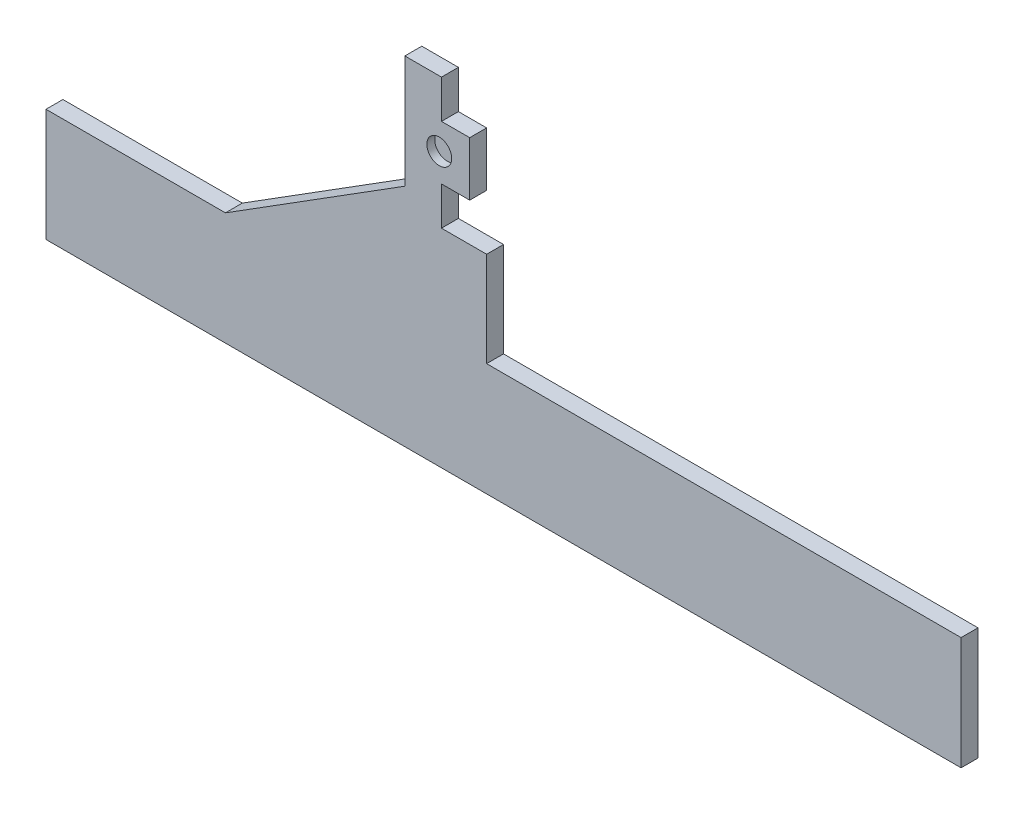
ISO-10303-21;
HEADER;
FILE_DESCRIPTION(('STEP AP214'),'2;1');
FILE_NAME('part.step','',(''),(''),'','','');
FILE_SCHEMA(('AUTOMOTIVE_DESIGN { 1 0 10303 214 1 1 1 1 }'));
ENDSEC;
DATA;
#1=APPLICATION_CONTEXT('core data for automotive mechanical design processes');
#2=APPLICATION_PROTOCOL_DEFINITION('international standard','automotive_design',2000,#1);
#3=PRODUCT_CONTEXT('',#1,'mechanical');
#4=PRODUCT('Part','Part','',(#3));
#5=PRODUCT_RELATED_PRODUCT_CATEGORY('part','',(#4));
#6=PRODUCT_DEFINITION_FORMATION('','',#4);
#7=PRODUCT_DEFINITION_CONTEXT('part definition',#1,'design');
#8=PRODUCT_DEFINITION('design','',#6,#7);
#9=PRODUCT_DEFINITION_SHAPE('','',#8);
#10=(LENGTH_UNIT() NAMED_UNIT(*) SI_UNIT(.MILLI.,.METRE.));
#11=(NAMED_UNIT(*) PLANE_ANGLE_UNIT() SI_UNIT($,.RADIAN.));
#12=(NAMED_UNIT(*) SI_UNIT($,.STERADIAN.) SOLID_ANGLE_UNIT());
#13=UNCERTAINTY_MEASURE_WITH_UNIT(LENGTH_MEASURE(1.E-05),#10,'distance_accuracy_value','');
#14=(GEOMETRIC_REPRESENTATION_CONTEXT(3) GLOBAL_UNCERTAINTY_ASSIGNED_CONTEXT((#13)) GLOBAL_UNIT_ASSIGNED_CONTEXT((#10,
#11,#12)) REPRESENTATION_CONTEXT('',''));
#15=CARTESIAN_POINT('',(0.,0.,0.));
#16=DIRECTION('',(0.,0.,1.));
#17=DIRECTION('',(1.,0.,0.));
#18=AXIS2_PLACEMENT_3D('',#15,#16,#17);
#19=CARTESIAN_POINT('',(-15.,50.,15.));
#20=DIRECTION('',(0.,-1.,0.));
#21=DIRECTION('',(0.,0.,-1.));
#22=AXIS2_PLACEMENT_3D('',#19,#20,#21);
#23=PLANE('',#22);
#24=DIRECTION('',(-1.,0.,0.));
#25=VECTOR('',#24,1.);
#26=CARTESIAN_POINT('',(-15.,50.,0.));
#27=LINE('',#26,#25);
#28=CARTESIAN_POINT('',(405.6,50.,0.));
#29=VERTEX_POINT('',#28);
#30=CARTESIAN_POINT('',(-15.,50.,0.));
#31=VERTEX_POINT('',#30);
#32=EDGE_CURVE('E171',#29,#31,#27,.T.);
#33=ORIENTED_EDGE('',*,*,#32,.T.);
#34=DIRECTION('',(0.,0.,-1.));
#35=VECTOR('',#34,1.);
#36=CARTESIAN_POINT('',(-15.,50.,15.));
#37=LINE('',#36,#35);
#38=CARTESIAN_POINT('',(-15.,50.,15.));
#39=VERTEX_POINT('',#38);
#40=EDGE_CURVE('E11',#39,#31,#37,.T.);
#41=ORIENTED_EDGE('',*,*,#40,.F.);
#42=DIRECTION('',(-1.,0.,0.));
#43=VECTOR('',#42,1.);
#44=CARTESIAN_POINT('',(-15.,50.,15.));
#45=LINE('',#44,#43);
#46=CARTESIAN_POINT('',(405.6,50.,15.));
#47=VERTEX_POINT('',#46);
#48=EDGE_CURVE('E200',#47,#39,#45,.T.);
#49=ORIENTED_EDGE('',*,*,#48,.F.);
#50=DIRECTION('',(0.,0.,-1.));
#51=VECTOR('',#50,1.);
#52=CARTESIAN_POINT('',(405.6,50.,15.));
#53=LINE('',#52,#51);
#54=EDGE_CURVE('E167',#47,#29,#53,.T.);
#55=ORIENTED_EDGE('',*,*,#54,.T.);
#56=EDGE_LOOP('',(#33,#41,#49,#55));
#57=FACE_BOUND('',#56,.T.);
#58=ADVANCED_FACE('F33',(#57),#23,.F.);
#59=CARTESIAN_POINT('',(-15.,50.,15.));
#60=DIRECTION('',(-1.,0.,0.));
#61=DIRECTION('',(0.,0.,1.));
#62=AXIS2_PLACEMENT_3D('',#59,#60,#61);
#63=PLANE('',#62);
#64=DIRECTION('',(0.,1.,0.));
#65=VECTOR('',#64,1.);
#66=CARTESIAN_POINT('',(-15.,50.,0.));
#67=LINE('',#66,#65);
#68=CARTESIAN_POINT('',(-15.,134.,0.));
#69=VERTEX_POINT('',#68);
#70=EDGE_CURVE('E174',#31,#69,#67,.T.);
#71=ORIENTED_EDGE('',*,*,#70,.T.);
#72=DIRECTION('',(0.,0.,-1.));
#73=VECTOR('',#72,1.);
#74=CARTESIAN_POINT('',(-15.,134.,15.));
#75=LINE('',#74,#73);
#76=CARTESIAN_POINT('',(-15.,134.,15.));
#77=VERTEX_POINT('',#76);
#78=EDGE_CURVE('E41',#77,#69,#75,.T.);
#79=ORIENTED_EDGE('',*,*,#78,.F.);
#80=DIRECTION('',(0.,1.,0.));
#81=VECTOR('',#80,1.);
#82=CARTESIAN_POINT('',(-15.,50.,15.));
#83=LINE('',#82,#81);
#84=EDGE_CURVE('E113',#39,#77,#83,.T.);
#85=ORIENTED_EDGE('',*,*,#84,.F.);
#86=ORIENTED_EDGE('',*,*,#40,.T.);
#87=EDGE_LOOP('',(#71,#79,#85,#86));
#88=FACE_BOUND('',#87,.T.);
#89=ADVANCED_FACE('F294',(#88),#63,.F.);
#90=CARTESIAN_POINT('',(-15.,134.,15.));
#91=DIRECTION('',(0.,-1.,0.));
#92=DIRECTION('',(1.,0.,0.));
#93=AXIS2_PLACEMENT_3D('',#90,#91,#92);
#94=PLANE('',#93);
#95=DIRECTION('',(-1.,0.,0.));
#96=VECTOR('',#95,1.);
#97=CARTESIAN_POINT('',(-15.,134.,0.));
#98=LINE('',#97,#96);
#99=CARTESIAN_POINT('',(-55.,134.,0.));
#100=VERTEX_POINT('',#99);
#101=EDGE_CURVE('E177',#69,#100,#98,.T.);
#102=ORIENTED_EDGE('',*,*,#101,.T.);
#103=DIRECTION('',(0.,0.,-1.));
#104=VECTOR('',#103,1.);
#105=CARTESIAN_POINT('',(-55.,134.,15.));
#106=LINE('',#105,#104);
#107=CARTESIAN_POINT('',(-55.,134.,15.));
#108=VERTEX_POINT('',#107);
#109=EDGE_CURVE('E228',#108,#100,#106,.T.);
#110=ORIENTED_EDGE('',*,*,#109,.F.);
#111=DIRECTION('',(-1.,0.,0.));
#112=VECTOR('',#111,1.);
#113=CARTESIAN_POINT('',(-15.,134.,15.));
#114=LINE('',#113,#112);
#115=EDGE_CURVE('E236',#77,#108,#114,.T.);
#116=ORIENTED_EDGE('',*,*,#115,.F.);
#117=ORIENTED_EDGE('',*,*,#78,.T.);
#118=EDGE_LOOP('',(#102,#110,#116,#117));
#119=FACE_BOUND('',#118,.T.);
#120=ADVANCED_FACE('F234',(#119),#94,.F.);
#121=CARTESIAN_POINT('',(-55.,134.,15.));
#122=DIRECTION('',(-1.,0.,0.));
#123=DIRECTION('',(0.,0.,1.));
#124=AXIS2_PLACEMENT_3D('',#121,#122,#123);
#125=PLANE('',#124);
#126=DIRECTION('',(0.,1.,0.));
#127=VECTOR('',#126,1.);
#128=CARTESIAN_POINT('',(-55.,134.,0.));
#129=LINE('',#128,#127);
#130=CARTESIAN_POINT('',(-55.,168.,0.));
#131=VERTEX_POINT('',#130);
#132=EDGE_CURVE('E179',#100,#131,#129,.T.);
#133=ORIENTED_EDGE('',*,*,#132,.T.);
#134=DIRECTION('',(0.,0.,-1.));
#135=VECTOR('',#134,1.);
#136=CARTESIAN_POINT('',(-55.,168.,15.));
#137=LINE('',#136,#135);
#138=CARTESIAN_POINT('',(-55.,168.,15.));
#139=VERTEX_POINT('',#138);
#140=EDGE_CURVE('E225',#139,#131,#137,.T.);
#141=ORIENTED_EDGE('',*,*,#140,.F.);
#142=DIRECTION('',(0.,1.,0.));
#143=VECTOR('',#142,1.);
#144=CARTESIAN_POINT('',(-55.,134.,15.));
#145=LINE('',#144,#143);
#146=EDGE_CURVE('E254',#108,#139,#145,.T.);
#147=ORIENTED_EDGE('',*,*,#146,.F.);
#148=ORIENTED_EDGE('',*,*,#109,.T.);
#149=EDGE_LOOP('',(#133,#141,#147,#148));
#150=FACE_BOUND('',#149,.T.);
#151=ADVANCED_FACE('F245',(#150),#125,.F.);
#152=CARTESIAN_POINT('',(-30.,168.,15.));
#153=DIRECTION('',(0.,1.,0.));
#154=DIRECTION('',(0.,0.,1.));
#155=AXIS2_PLACEMENT_3D('',#152,#153,#154);
#156=PLANE('',#155);
#157=DIRECTION('',(1.,0.,0.));
#158=VECTOR('',#157,1.);
#159=CARTESIAN_POINT('',(-30.,168.,0.));
#160=LINE('',#159,#158);
#161=CARTESIAN_POINT('',(-30.,168.,0.));
#162=VERTEX_POINT('',#161);
#163=EDGE_CURVE('E181',#131,#162,#160,.T.);
#164=ORIENTED_EDGE('',*,*,#163,.T.);
#165=DIRECTION('',(0.,0.,-1.));
#166=VECTOR('',#165,1.);
#167=CARTESIAN_POINT('',(-30.,168.,15.));
#168=LINE('',#167,#166);
#169=CARTESIAN_POINT('',(-30.,168.,15.));
#170=VERTEX_POINT('',#169);
#171=EDGE_CURVE('E222',#170,#162,#168,.T.);
#172=ORIENTED_EDGE('',*,*,#171,.F.);
#173=DIRECTION('',(1.,0.,0.));
#174=VECTOR('',#173,1.);
#175=CARTESIAN_POINT('',(-30.,168.,15.));
#176=LINE('',#175,#174);
#177=EDGE_CURVE('E251',#139,#170,#176,.T.);
#178=ORIENTED_EDGE('',*,*,#177,.F.);
#179=ORIENTED_EDGE('',*,*,#140,.T.);
#180=EDGE_LOOP('',(#164,#172,#178,#179));
#181=FACE_BOUND('',#180,.T.);
#182=ADVANCED_FACE('F249',(#181),#156,.F.);
#183=CARTESIAN_POINT('',(-30.,168.,15.));
#184=DIRECTION('',(-1.,0.,0.));
#185=DIRECTION('',(0.,0.,1.));
#186=AXIS2_PLACEMENT_3D('',#183,#184,#185);
#187=PLANE('',#186);
#188=DIRECTION('',(0.,1.,0.));
#189=VECTOR('',#188,1.);
#190=CARTESIAN_POINT('',(-30.,168.,0.));
#191=LINE('',#190,#189);
#192=CARTESIAN_POINT('',(-30.,216.,0.));
#193=VERTEX_POINT('',#192);
#194=EDGE_CURVE('E183',#162,#193,#191,.T.);
#195=ORIENTED_EDGE('',*,*,#194,.T.);
#196=DIRECTION('',(0.,0.,-1.));
#197=VECTOR('',#196,1.);
#198=CARTESIAN_POINT('',(-30.,216.,15.));
#199=LINE('',#198,#197);
#200=CARTESIAN_POINT('',(-30.,216.,15.));
#201=VERTEX_POINT('',#200);
#202=EDGE_CURVE('E219',#201,#193,#199,.T.);
#203=ORIENTED_EDGE('',*,*,#202,.F.);
#204=DIRECTION('',(0.,1.,0.));
#205=VECTOR('',#204,1.);
#206=CARTESIAN_POINT('',(-30.,168.,15.));
#207=LINE('',#206,#205);
#208=EDGE_CURVE('E253',#170,#201,#207,.T.);
#209=ORIENTED_EDGE('',*,*,#208,.F.);
#210=ORIENTED_EDGE('',*,*,#171,.T.);
#211=EDGE_LOOP('',(#195,#203,#209,#210));
#212=FACE_BOUND('',#211,.T.);
#213=ADVANCED_FACE('F307',(#212),#187,.F.);
#214=CARTESIAN_POINT('',(-30.,216.,15.));
#215=DIRECTION('',(0.,-1.,0.));
#216=DIRECTION('',(0.,0.,-1.));
#217=AXIS2_PLACEMENT_3D('',#214,#215,#216);
#218=PLANE('',#217);
#219=DIRECTION('',(-1.,0.,0.));
#220=VECTOR('',#219,1.);
#221=CARTESIAN_POINT('',(-30.,216.,0.));
#222=LINE('',#221,#220);
#223=CARTESIAN_POINT('',(-55.,216.,0.));
#224=VERTEX_POINT('',#223);
#225=EDGE_CURVE('E185',#193,#224,#222,.T.);
#226=ORIENTED_EDGE('',*,*,#225,.T.);
#227=DIRECTION('',(0.,0.,-1.));
#228=VECTOR('',#227,1.);
#229=CARTESIAN_POINT('',(-55.,216.,15.));
#230=LINE('',#229,#228);
#231=CARTESIAN_POINT('',(-55.,216.,15.));
#232=VERTEX_POINT('',#231);
#233=EDGE_CURVE('E216',#232,#224,#230,.T.);
#234=ORIENTED_EDGE('',*,*,#233,.F.);
#235=DIRECTION('',(-1.,0.,0.));
#236=VECTOR('',#235,1.);
#237=CARTESIAN_POINT('',(-30.,216.,15.));
#238=LINE('',#237,#236);
#239=EDGE_CURVE('E256',#201,#232,#238,.T.);
#240=ORIENTED_EDGE('',*,*,#239,.F.);
#241=ORIENTED_EDGE('',*,*,#202,.T.);
#242=EDGE_LOOP('',(#226,#234,#240,#241));
#243=FACE_BOUND('',#242,.T.);
#244=ADVANCED_FACE('F310',(#243),#218,.F.);
#245=CARTESIAN_POINT('',(-55.,250.,15.));
#246=DIRECTION('',(-1.,0.,0.));
#247=DIRECTION('',(0.,-1.,0.));
#248=AXIS2_PLACEMENT_3D('',#245,#246,#247);
#249=PLANE('',#248);
#250=DIRECTION('',(0.,1.,0.));
#251=VECTOR('',#250,1.);
#252=CARTESIAN_POINT('',(-55.,250.,0.));
#253=LINE('',#252,#251);
#254=CARTESIAN_POINT('',(-55.,250.,0.));
#255=VERTEX_POINT('',#254);
#256=EDGE_CURVE('E187',#224,#255,#253,.T.);
#257=ORIENTED_EDGE('',*,*,#256,.T.);
#258=DIRECTION('',(0.,0.,-1.));
#259=VECTOR('',#258,1.);
#260=CARTESIAN_POINT('',(-55.,250.,15.));
#261=LINE('',#260,#259);
#262=CARTESIAN_POINT('',(-55.,250.,15.));
#263=VERTEX_POINT('',#262);
#264=EDGE_CURVE('E213',#263,#255,#261,.T.);
#265=ORIENTED_EDGE('',*,*,#264,.F.);
#266=DIRECTION('',(0.,1.,0.));
#267=VECTOR('',#266,1.);
#268=CARTESIAN_POINT('',(-55.,250.,15.));
#269=LINE('',#268,#267);
#270=EDGE_CURVE('E262',#232,#263,#269,.T.);
#271=ORIENTED_EDGE('',*,*,#270,.F.);
#272=ORIENTED_EDGE('',*,*,#233,.T.);
#273=EDGE_LOOP('',(#257,#265,#271,#272));
#274=FACE_BOUND('',#273,.T.);
#275=ADVANCED_FACE('F314',(#274),#249,.F.);
#276=CARTESIAN_POINT('',(-55.,250.,15.));
#277=DIRECTION('',(0.,-1.,0.));
#278=DIRECTION('',(0.,0.,-1.));
#279=AXIS2_PLACEMENT_3D('',#276,#277,#278);
#280=PLANE('',#279);
#281=DIRECTION('',(-1.,0.,0.));
#282=VECTOR('',#281,1.);
#283=CARTESIAN_POINT('',(-55.,250.,0.));
#284=LINE('',#283,#282);
#285=CARTESIAN_POINT('',(-87.48,250.,0.));
#286=VERTEX_POINT('',#285);
#287=EDGE_CURVE('E189',#255,#286,#284,.T.);
#288=ORIENTED_EDGE('',*,*,#287,.T.);
#289=DIRECTION('',(0.,0.,-1.));
#290=VECTOR('',#289,1.);
#291=CARTESIAN_POINT('',(-87.48,250.,15.));
#292=LINE('',#291,#290);
#293=CARTESIAN_POINT('',(-87.48,250.,15.));
#294=VERTEX_POINT('',#293);
#295=EDGE_CURVE('E210',#294,#286,#292,.T.);
#296=ORIENTED_EDGE('',*,*,#295,.F.);
#297=DIRECTION('',(-1.,0.,0.));
#298=VECTOR('',#297,1.);
#299=CARTESIAN_POINT('',(-55.,250.,15.));
#300=LINE('',#299,#298);
#301=EDGE_CURVE('E264',#263,#294,#300,.T.);
#302=ORIENTED_EDGE('',*,*,#301,.F.);
#303=ORIENTED_EDGE('',*,*,#264,.T.);
#304=EDGE_LOOP('',(#288,#296,#302,#303));
#305=FACE_BOUND('',#304,.T.);
#306=ADVANCED_FACE('F318',(#305),#280,.F.);
#307=CARTESIAN_POINT('',(-87.48,250.,15.));
#308=DIRECTION('',(1.,0.,0.));
#309=DIRECTION('',(0.,1.,0.));
#310=AXIS2_PLACEMENT_3D('',#307,#308,#309);
#311=PLANE('',#310);
#312=DIRECTION('',(0.,-1.,0.));
#313=VECTOR('',#312,1.);
#314=CARTESIAN_POINT('',(-87.48,250.,0.));
#315=LINE('',#314,#313);
#316=CARTESIAN_POINT('',(-87.48,150.,0.));
#317=VERTEX_POINT('',#316);
#318=EDGE_CURVE('E191',#286,#317,#315,.T.);
#319=ORIENTED_EDGE('',*,*,#318,.T.);
#320=DIRECTION('',(0.,0.,-1.));
#321=VECTOR('',#320,1.);
#322=CARTESIAN_POINT('',(-87.48,150.,15.));
#323=LINE('',#322,#321);
#324=CARTESIAN_POINT('',(-87.48,150.,15.));
#325=VERTEX_POINT('',#324);
#326=EDGE_CURVE('E207',#325,#317,#323,.T.);
#327=ORIENTED_EDGE('',*,*,#326,.F.);
#328=DIRECTION('',(0.,-1.,0.));
#329=VECTOR('',#328,1.);
#330=CARTESIAN_POINT('',(-87.48,250.,15.));
#331=LINE('',#330,#329);
#332=EDGE_CURVE('E266',#294,#325,#331,.T.);
#333=ORIENTED_EDGE('',*,*,#332,.F.);
#334=ORIENTED_EDGE('',*,*,#295,.T.);
#335=EDGE_LOOP('',(#319,#327,#333,#334));
#336=FACE_BOUND('',#335,.T.);
#337=ADVANCED_FACE('F322',(#336),#311,.F.);
#338=CARTESIAN_POINT('',(-87.48,150.,15.));
#339=DIRECTION('',(0.532245665161482,-0.846589955005853,0.));
#340=DIRECTION('',(0.846589955005853,0.532245665161482,0.));
#341=AXIS2_PLACEMENT_3D('',#338,#339,#340);
#342=PLANE('',#341);
#343=DIRECTION('',(-0.846589955005853,-0.532245665161482,0.));
#344=VECTOR('',#343,1.);
#345=CARTESIAN_POINT('',(-87.48,150.,0.));
#346=LINE('',#345,#344);
#347=CARTESIAN_POINT('',(-246.54,50.,0.));
#348=VERTEX_POINT('',#347);
#349=EDGE_CURVE('E193',#317,#348,#346,.T.);
#350=ORIENTED_EDGE('',*,*,#349,.T.);
#351=DIRECTION('',(0.,0.,-1.));
#352=VECTOR('',#351,1.);
#353=CARTESIAN_POINT('',(-246.54,50.,15.));
#354=LINE('',#353,#352);
#355=CARTESIAN_POINT('',(-246.54,50.,15.));
#356=VERTEX_POINT('',#355);
#357=EDGE_CURVE('E204',#356,#348,#354,.T.);
#358=ORIENTED_EDGE('',*,*,#357,.F.);
#359=DIRECTION('',(-0.846589955005853,-0.532245665161482,0.));
#360=VECTOR('',#359,1.);
#361=CARTESIAN_POINT('',(-87.48,150.,15.));
#362=LINE('',#361,#360);
#363=EDGE_CURVE('E268',#325,#356,#362,.T.);
#364=ORIENTED_EDGE('',*,*,#363,.F.);
#365=ORIENTED_EDGE('',*,*,#326,.T.);
#366=EDGE_LOOP('',(#350,#358,#364,#365));
#367=FACE_BOUND('',#366,.T.);
#368=ADVANCED_FACE('F274',(#367),#342,.F.);
#369=CARTESIAN_POINT('',(-405.6,50.,15.));
#370=DIRECTION('',(0.,-1.,0.));
#371=DIRECTION('',(0.,0.,-1.));
#372=AXIS2_PLACEMENT_3D('',#369,#370,#371);
#373=PLANE('',#372);
#374=DIRECTION('',(-1.,0.,0.));
#375=VECTOR('',#374,1.);
#376=CARTESIAN_POINT('',(-405.6,50.,0.));
#377=LINE('',#376,#375);
#378=CARTESIAN_POINT('',(-405.6,50.,0.));
#379=VERTEX_POINT('',#378);
#380=EDGE_CURVE('E195',#348,#379,#377,.T.);
#381=ORIENTED_EDGE('',*,*,#380,.T.);
#382=DIRECTION('',(0.,0.,-1.));
#383=VECTOR('',#382,1.);
#384=CARTESIAN_POINT('',(-405.6,50.,15.));
#385=LINE('',#384,#383);
#386=CARTESIAN_POINT('',(-405.6,50.,15.));
#387=VERTEX_POINT('',#386);
#388=EDGE_CURVE('E162',#387,#379,#385,.T.);
#389=ORIENTED_EDGE('',*,*,#388,.F.);
#390=DIRECTION('',(-1.,0.,0.));
#391=VECTOR('',#390,1.);
#392=CARTESIAN_POINT('',(-405.6,50.,15.));
#393=LINE('',#392,#391);
#394=EDGE_CURVE('E153',#356,#387,#393,.T.);
#395=ORIENTED_EDGE('',*,*,#394,.F.);
#396=ORIENTED_EDGE('',*,*,#357,.T.);
#397=EDGE_LOOP('',(#381,#389,#395,#396));
#398=FACE_BOUND('',#397,.T.);
#399=ADVANCED_FACE('F278',(#398),#373,.F.);
#400=CARTESIAN_POINT('',(-405.6,-50.,15.));
#401=DIRECTION('',(1.,0.,0.));
#402=DIRECTION('',(0.,0.,-1.));
#403=AXIS2_PLACEMENT_3D('',#400,#401,#402);
#404=PLANE('',#403);
#405=DIRECTION('',(0.,-1.,0.));
#406=VECTOR('',#405,1.);
#407=CARTESIAN_POINT('',(-405.6,-50.,0.));
#408=LINE('',#407,#406);
#409=CARTESIAN_POINT('',(-405.6,-50.,0.));
#410=VERTEX_POINT('',#409);
#411=EDGE_CURVE('E161',#379,#410,#408,.T.);
#412=ORIENTED_EDGE('',*,*,#411,.T.);
#413=DIRECTION('',(0.,0.,-1.));
#414=VECTOR('',#413,1.);
#415=CARTESIAN_POINT('',(-405.6,-50.,15.));
#416=LINE('',#415,#414);
#417=CARTESIAN_POINT('',(-405.6,-50.,15.));
#418=VERTEX_POINT('',#417);
#419=EDGE_CURVE('E158',#418,#410,#416,.T.);
#420=ORIENTED_EDGE('',*,*,#419,.F.);
#421=DIRECTION('',(0.,-1.,0.));
#422=VECTOR('',#421,1.);
#423=CARTESIAN_POINT('',(-405.6,-50.,15.));
#424=LINE('',#423,#422);
#425=EDGE_CURVE('E147',#387,#418,#424,.T.);
#426=ORIENTED_EDGE('',*,*,#425,.F.);
#427=ORIENTED_EDGE('',*,*,#388,.T.);
#428=EDGE_LOOP('',(#412,#420,#426,#427));
#429=FACE_BOUND('',#428,.T.);
#430=ADVANCED_FACE('F159',(#429),#404,.F.);
#431=CARTESIAN_POINT('',(-405.6,-50.,15.));
#432=DIRECTION('',(0.,1.,0.));
#433=DIRECTION('',(0.,0.,1.));
#434=AXIS2_PLACEMENT_3D('',#431,#432,#433);
#435=PLANE('',#434);
#436=DIRECTION('',(1.,0.,0.));
#437=VECTOR('',#436,1.);
#438=CARTESIAN_POINT('',(-405.6,-50.,0.));
#439=LINE('',#438,#437);
#440=CARTESIAN_POINT('',(405.6,-50.,0.));
#441=VERTEX_POINT('',#440);
#442=EDGE_CURVE('E99',#410,#441,#439,.T.);
#443=ORIENTED_EDGE('',*,*,#442,.T.);
#444=DIRECTION('',(0.,0.,-1.));
#445=VECTOR('',#444,1.);
#446=CARTESIAN_POINT('',(405.6,-50.,15.));
#447=LINE('',#446,#445);
#448=CARTESIAN_POINT('',(405.6,-50.,15.));
#449=VERTEX_POINT('',#448);
#450=EDGE_CURVE('E163',#449,#441,#447,.T.);
#451=ORIENTED_EDGE('',*,*,#450,.F.);
#452=DIRECTION('',(1.,0.,0.));
#453=VECTOR('',#452,1.);
#454=CARTESIAN_POINT('',(-405.6,-50.,15.));
#455=LINE('',#454,#453);
#456=EDGE_CURVE('E151',#418,#449,#455,.T.);
#457=ORIENTED_EDGE('',*,*,#456,.F.);
#458=ORIENTED_EDGE('',*,*,#419,.T.);
#459=EDGE_LOOP('',(#443,#451,#457,#458));
#460=FACE_BOUND('',#459,.T.);
#461=ADVANCED_FACE('F165',(#460),#435,.F.);
#462=CARTESIAN_POINT('',(405.6,-50.,15.));
#463=DIRECTION('',(-1.,0.,0.));
#464=DIRECTION('',(0.,0.,1.));
#465=AXIS2_PLACEMENT_3D('',#462,#463,#464);
#466=PLANE('',#465);
#467=DIRECTION('',(0.,1.,0.));
#468=VECTOR('',#467,1.);
#469=CARTESIAN_POINT('',(405.6,-50.,0.));
#470=LINE('',#469,#468);
#471=EDGE_CURVE('E105',#441,#29,#470,.T.);
#472=ORIENTED_EDGE('',*,*,#471,.T.);
#473=ORIENTED_EDGE('',*,*,#54,.F.);
#474=DIRECTION('',(0.,1.,0.));
#475=VECTOR('',#474,1.);
#476=CARTESIAN_POINT('',(405.6,-50.,15.));
#477=LINE('',#476,#475);
#478=EDGE_CURVE('E49',#449,#47,#477,.T.);
#479=ORIENTED_EDGE('',*,*,#478,.F.);
#480=ORIENTED_EDGE('',*,*,#450,.T.);
#481=EDGE_LOOP('',(#472,#473,#479,#480));
#482=FACE_BOUND('',#481,.T.);
#483=ADVANCED_FACE('F282',(#482),#466,.F.);
#484=CARTESIAN_POINT('',(0.,0.,15.));
#485=DIRECTION('',(0.,0.,1.));
#486=DIRECTION('',(1.,0.,0.));
#487=AXIS2_PLACEMENT_3D('',#484,#485,#486);
#488=PLANE('',#487);
#489=CARTESIAN_POINT('',(-56.98,192.,15.));
#490=DIRECTION('',(0.,0.,1.));
#491=DIRECTION('',(1.,0.,0.));
#492=AXIS2_PLACEMENT_3D('',#489,#490,#491);
#493=CIRCLE('',#492,11.);
#494=CARTESIAN_POINT('',(-45.98,192.,15.));
#495=VERTEX_POINT('',#494);
#496=EDGE_CURVE('E383',#495,#495,#493,.T.);
#497=ORIENTED_EDGE('',*,*,#496,.F.);
#498=EDGE_LOOP('',(#497));
#499=FACE_BOUND('',#498,.T.);
#500=ORIENTED_EDGE('',*,*,#48,.T.);
#501=ORIENTED_EDGE('',*,*,#84,.T.);
#502=ORIENTED_EDGE('',*,*,#115,.T.);
#503=ORIENTED_EDGE('',*,*,#146,.T.);
#504=ORIENTED_EDGE('',*,*,#177,.T.);
#505=ORIENTED_EDGE('',*,*,#208,.T.);
#506=ORIENTED_EDGE('',*,*,#239,.T.);
#507=ORIENTED_EDGE('',*,*,#270,.T.);
#508=ORIENTED_EDGE('',*,*,#301,.T.);
#509=ORIENTED_EDGE('',*,*,#332,.T.);
#510=ORIENTED_EDGE('',*,*,#363,.T.);
#511=ORIENTED_EDGE('',*,*,#394,.T.);
#512=ORIENTED_EDGE('',*,*,#425,.T.);
#513=ORIENTED_EDGE('',*,*,#456,.T.);
#514=ORIENTED_EDGE('',*,*,#478,.T.);
#515=EDGE_LOOP('',(#500,#501,#502,#503,#504,#505,#506,#507,#508,#509,#510,#511,#512,#513,#514));
#516=FACE_BOUND('',#515,.T.);
#517=ADVANCED_FACE('F149',(#499,#516),#488,.T.);
#518=CARTESIAN_POINT('',(0.,0.,0.));
#519=DIRECTION('',(0.,0.,1.));
#520=DIRECTION('',(1.,0.,0.));
#521=AXIS2_PLACEMENT_3D('',#518,#519,#520);
#522=PLANE('',#521);
#523=ORIENTED_EDGE('',*,*,#32,.F.);
#524=ORIENTED_EDGE('',*,*,#471,.F.);
#525=ORIENTED_EDGE('',*,*,#442,.F.);
#526=ORIENTED_EDGE('',*,*,#411,.F.);
#527=ORIENTED_EDGE('',*,*,#380,.F.);
#528=ORIENTED_EDGE('',*,*,#349,.F.);
#529=ORIENTED_EDGE('',*,*,#318,.F.);
#530=ORIENTED_EDGE('',*,*,#287,.F.);
#531=ORIENTED_EDGE('',*,*,#256,.F.);
#532=ORIENTED_EDGE('',*,*,#225,.F.);
#533=ORIENTED_EDGE('',*,*,#194,.F.);
#534=ORIENTED_EDGE('',*,*,#163,.F.);
#535=ORIENTED_EDGE('',*,*,#132,.F.);
#536=ORIENTED_EDGE('',*,*,#101,.F.);
#537=ORIENTED_EDGE('',*,*,#70,.F.);
#538=EDGE_LOOP('',(#523,#524,#525,#526,#527,#528,#529,#530,#531,#532,#533,#534,#535,#536,#537));
#539=FACE_BOUND('',#538,.T.);
#540=ADVANCED_FACE('F240',(#539),#522,.F.);
#541=CARTESIAN_POINT('',(-56.98,192.,8.));
#542=DIRECTION('',(0.,0.,1.));
#543=DIRECTION('',(1.,0.,0.));
#544=AXIS2_PLACEMENT_3D('',#541,#542,#543);
#545=CYLINDRICAL_SURFACE('',#544,11.);
#546=CARTESIAN_POINT('',(-56.98,192.,8.));
#547=DIRECTION('',(0.,0.,1.));
#548=DIRECTION('',(1.,0.,0.));
#549=AXIS2_PLACEMENT_3D('',#546,#547,#548);
#550=CIRCLE('',#549,11.);
#551=CARTESIAN_POINT('',(-45.98,192.,8.));
#552=VERTEX_POINT('',#551);
#553=EDGE_CURVE('E175',#552,#552,#550,.T.);
#554=ORIENTED_EDGE('',*,*,#553,.F.);
#555=EDGE_LOOP('',(#554));
#556=FACE_BOUND('',#555,.T.);
#557=ORIENTED_EDGE('',*,*,#496,.T.);
#558=EDGE_LOOP('',(#557));
#559=FACE_BOUND('',#558,.T.);
#560=ADVANCED_FACE('F354',(#556,#559),#545,.F.);
#561=CARTESIAN_POINT('',(-56.98,192.,8.));
#562=DIRECTION('',(0.,0.,1.));
#563=DIRECTION('',(1.,0.,0.));
#564=AXIS2_PLACEMENT_3D('',#561,#562,#563);
#565=PLANE('',#564);
#566=ORIENTED_EDGE('',*,*,#553,.T.);
#567=EDGE_LOOP('',(#566));
#568=FACE_BOUND('',#567,.T.);
#569=ADVANCED_FACE('F367',(#568),#565,.T.);
#570=CLOSED_SHELL('',(#58,#89,#120,#151,#182,#213,#244,#275,#306,#337,#368,#399,#430,#461,#483,
#517,#540,#560,#569));
#571=MANIFOLD_SOLID_BREP('B2',#570);
#572=ADVANCED_BREP_SHAPE_REPRESENTATION('',(#18,#571),#14);
#573=SHAPE_DEFINITION_REPRESENTATION(#9,#572);
ENDSEC;
END-ISO-10303-21;
